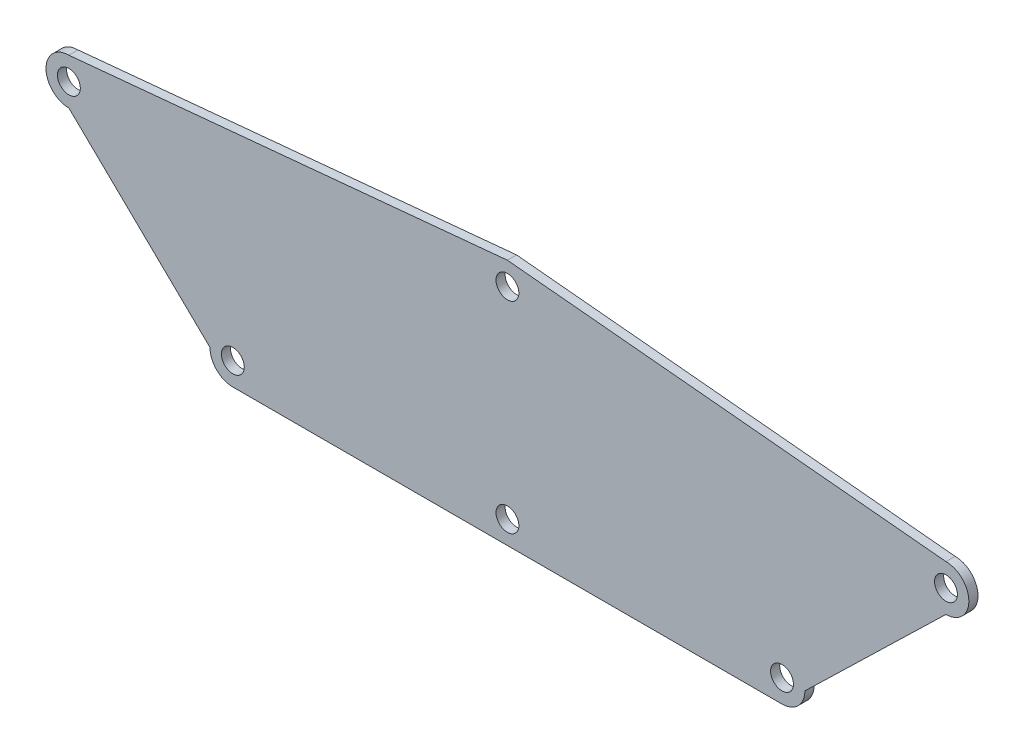
ISO-10303-21;
HEADER;
FILE_DESCRIPTION(('STEP AP214'),'2;1');
FILE_NAME('part.step','',(''),(''),'','','');
FILE_SCHEMA(('AUTOMOTIVE_DESIGN { 1 0 10303 214 1 1 1 1 }'));
ENDSEC;
DATA;
#1=APPLICATION_CONTEXT('core data for automotive mechanical design processes');
#2=APPLICATION_PROTOCOL_DEFINITION('international standard','automotive_design',2000,#1);
#3=PRODUCT_CONTEXT('',#1,'mechanical');
#4=PRODUCT('Part','Part','',(#3));
#5=PRODUCT_RELATED_PRODUCT_CATEGORY('part','',(#4));
#6=PRODUCT_DEFINITION_FORMATION('','',#4);
#7=PRODUCT_DEFINITION_CONTEXT('part definition',#1,'design');
#8=PRODUCT_DEFINITION('design','',#6,#7);
#9=PRODUCT_DEFINITION_SHAPE('','',#8);
#10=(LENGTH_UNIT() NAMED_UNIT(*) SI_UNIT(.MILLI.,.METRE.));
#11=(NAMED_UNIT(*) PLANE_ANGLE_UNIT() SI_UNIT($,.RADIAN.));
#12=(NAMED_UNIT(*) SI_UNIT($,.STERADIAN.) SOLID_ANGLE_UNIT());
#13=UNCERTAINTY_MEASURE_WITH_UNIT(LENGTH_MEASURE(1.E-05),#10,'distance_accuracy_value','');
#14=(GEOMETRIC_REPRESENTATION_CONTEXT(3) GLOBAL_UNCERTAINTY_ASSIGNED_CONTEXT((#13)) GLOBAL_UNIT_ASSIGNED_CONTEXT((#10,
#11,#12)) REPRESENTATION_CONTEXT('',''));
#15=CARTESIAN_POINT('',(0.,0.,0.));
#16=DIRECTION('',(0.,0.,1.));
#17=DIRECTION('',(1.,0.,0.));
#18=AXIS2_PLACEMENT_3D('',#15,#16,#17);
#19=CARTESIAN_POINT('',(31.4847093761798,-32.4841374358191,2.));
#20=DIRECTION('',(0.695974241081465,-0.718066748813144,0.));
#21=DIRECTION('',(0.718066748813144,0.695974241081465,0.));
#22=AXIS2_PLACEMENT_3D('',#19,#20,#21);
#23=PLANE('',#22);
#24=DIRECTION('',(-0.718066748813144,-0.695974241081465,0.));
#25=VECTOR('',#24,1.);
#26=CARTESIAN_POINT('',(31.4847093761798,-32.4841374358191,0.));
#27=LINE('',#26,#25);
#28=CARTESIAN_POINT('',(95.8263707407327,29.8779466073845,0.));
#29=VERTEX_POINT('',#28);
#30=CARTESIAN_POINT('',(65.,0.,0.));
#31=VERTEX_POINT('',#30);
#32=EDGE_CURVE('E153',#29,#31,#27,.T.);
#33=ORIENTED_EDGE('',*,*,#32,.F.);
#34=DIRECTION('',(0.,0.,-1.));
#35=VECTOR('',#34,1.);
#36=CARTESIAN_POINT('',(95.8263707407327,29.8779466073845,2.));
#37=LINE('',#36,#35);
#38=CARTESIAN_POINT('',(95.8263707407327,29.8779466073845,2.));
#39=VERTEX_POINT('',#38);
#40=EDGE_CURVE('E11',#39,#29,#37,.T.);
#41=ORIENTED_EDGE('',*,*,#40,.F.);
#42=DIRECTION('',(-0.718066748813144,-0.695974241081465,0.));
#43=VECTOR('',#42,1.);
#44=CARTESIAN_POINT('',(31.4847093761798,-32.4841374358191,2.));
#45=LINE('',#44,#43);
#46=CARTESIAN_POINT('',(65.,0.,2.));
#47=VERTEX_POINT('',#46);
#48=EDGE_CURVE('E192',#39,#47,#45,.T.);
#49=ORIENTED_EDGE('',*,*,#48,.T.);
#50=DIRECTION('',(0.,0.,-1.));
#51=VECTOR('',#50,1.);
#52=CARTESIAN_POINT('',(65.,0.,2.));
#53=LINE('',#52,#51);
#54=EDGE_CURVE('E87',#47,#31,#53,.T.);
#55=ORIENTED_EDGE('',*,*,#54,.T.);
#56=EDGE_LOOP('',(#33,#41,#49,#55));
#57=FACE_BOUND('',#56,.T.);
#58=ADVANCED_FACE('F34',(#57),#23,.T.);
#59=CARTESIAN_POINT('',(95.8263707407328,34.8779466073845,2.));
#60=DIRECTION('',(0.,0.,-1.));
#61=DIRECTION('',(-1.,0.,0.));
#62=AXIS2_PLACEMENT_3D('',#59,#60,#61);
#63=CYLINDRICAL_SURFACE('',#62,5.00000000000001);
#64=CARTESIAN_POINT('',(95.8263707407328,34.8779466073845,0.));
#65=DIRECTION('',(0.,0.,1.));
#66=DIRECTION('',(1.,0.,0.));
#67=AXIS2_PLACEMENT_3D('',#64,#65,#66);
#68=CIRCLE('',#67,5.00000000000001);
#69=CARTESIAN_POINT('',(95.8263707407328,39.8779466073845,0.));
#70=VERTEX_POINT('',#69);
#71=EDGE_CURVE('E156',#29,#70,#68,.T.);
#72=ORIENTED_EDGE('',*,*,#71,.T.);
#73=DIRECTION('',(0.,0.,-1.));
#74=VECTOR('',#73,1.);
#75=CARTESIAN_POINT('',(95.8263707407328,39.8779466073845,2.));
#76=LINE('',#75,#74);
#77=CARTESIAN_POINT('',(95.8263707407328,39.8779466073845,2.));
#78=VERTEX_POINT('',#77);
#79=EDGE_CURVE('E42',#78,#70,#76,.T.);
#80=ORIENTED_EDGE('',*,*,#79,.F.);
#81=CARTESIAN_POINT('',(95.8263707407328,34.8779466073845,2.));
#82=DIRECTION('',(0.,0.,1.));
#83=DIRECTION('',(1.,0.,0.));
#84=AXIS2_PLACEMENT_3D('',#81,#82,#83);
#85=CIRCLE('',#84,5.00000000000001);
#86=EDGE_CURVE('E224',#39,#78,#85,.T.);
#87=ORIENTED_EDGE('',*,*,#86,.F.);
#88=ORIENTED_EDGE('',*,*,#40,.T.);
#89=EDGE_LOOP('',(#72,#80,#87,#88));
#90=FACE_BOUND('',#89,.T.);
#91=ADVANCED_FACE('F211',(#90),#63,.T.);
#92=CARTESIAN_POINT('',(4.62259535135623,48.5599586911038,2.));
#93=DIRECTION('',(0.0947651564417708,0.995499656014288,0.));
#94=DIRECTION('',(-0.995499656014289,0.0947651564417708,0.));
#95=AXIS2_PLACEMENT_3D('',#92,#93,#94);
#96=PLANE('',#95);
#97=DIRECTION('',(0.995499656014289,-0.0947651564417708,0.));
#98=VECTOR('',#97,1.);
#99=CARTESIAN_POINT('',(4.62259535135623,48.5599586911038,0.));
#100=LINE('',#99,#98);
#101=CARTESIAN_POINT('',(0.,49.,0.));
#102=VERTEX_POINT('',#101);
#103=EDGE_CURVE('E159',#102,#70,#100,.T.);
#104=ORIENTED_EDGE('',*,*,#103,.F.);
#105=DIRECTION('',(0.,0.,-1.));
#106=VECTOR('',#105,1.);
#107=CARTESIAN_POINT('',(0.,49.,2.));
#108=LINE('',#107,#106);
#109=CARTESIAN_POINT('',(0.,49.,2.));
#110=VERTEX_POINT('',#109);
#111=EDGE_CURVE('E201',#110,#102,#108,.T.);
#112=ORIENTED_EDGE('',*,*,#111,.F.);
#113=DIRECTION('',(0.995499656014289,-0.0947651564417708,0.));
#114=VECTOR('',#113,1.);
#115=CARTESIAN_POINT('',(4.62259535135623,48.5599586911038,2.));
#116=LINE('',#115,#114);
#117=EDGE_CURVE('E208',#110,#78,#116,.T.);
#118=ORIENTED_EDGE('',*,*,#117,.T.);
#119=ORIENTED_EDGE('',*,*,#79,.T.);
#120=EDGE_LOOP('',(#104,#112,#118,#119));
#121=FACE_BOUND('',#120,.T.);
#122=ADVANCED_FACE('F206',(#121),#96,.T.);
#123=CARTESIAN_POINT('',(-4.62259535135623,48.5599586911038,2.));
#124=DIRECTION('',(-0.0947651564417708,0.995499656014288,0.));
#125=DIRECTION('',(-0.995499656014289,-0.0947651564417708,0.));
#126=AXIS2_PLACEMENT_3D('',#123,#124,#125);
#127=PLANE('',#126);
#128=DIRECTION('',(0.995499656014289,0.0947651564417708,0.));
#129=VECTOR('',#128,1.);
#130=CARTESIAN_POINT('',(-4.62259535135623,48.5599586911038,0.));
#131=LINE('',#130,#129);
#132=CARTESIAN_POINT('',(-95.8263707407328,39.8779466073845,0.));
#133=VERTEX_POINT('',#132);
#134=EDGE_CURVE('E162',#133,#102,#131,.T.);
#135=ORIENTED_EDGE('',*,*,#134,.F.);
#136=DIRECTION('',(0.,0.,-1.));
#137=VECTOR('',#136,1.);
#138=CARTESIAN_POINT('',(-95.8263707407328,39.8779466073845,2.));
#139=LINE('',#138,#137);
#140=CARTESIAN_POINT('',(-95.8263707407328,39.8779466073845,2.));
#141=VERTEX_POINT('',#140);
#142=EDGE_CURVE('E199',#141,#133,#139,.T.);
#143=ORIENTED_EDGE('',*,*,#142,.F.);
#144=DIRECTION('',(0.995499656014289,0.0947651564417708,0.));
#145=VECTOR('',#144,1.);
#146=CARTESIAN_POINT('',(-4.62259535135623,48.5599586911038,2.));
#147=LINE('',#146,#145);
#148=EDGE_CURVE('E223',#141,#110,#147,.T.);
#149=ORIENTED_EDGE('',*,*,#148,.T.);
#150=ORIENTED_EDGE('',*,*,#111,.T.);
#151=EDGE_LOOP('',(#135,#143,#149,#150));
#152=FACE_BOUND('',#151,.T.);
#153=ADVANCED_FACE('F219',(#152),#127,.T.);
#154=CARTESIAN_POINT('',(-95.8263707407327,34.8779466073845,2.));
#155=DIRECTION('',(0.,0.,-1.));
#156=DIRECTION('',(-1.,0.,0.));
#157=AXIS2_PLACEMENT_3D('',#154,#155,#156);
#158=CYLINDRICAL_SURFACE('',#157,5.00000000000001);
#159=CARTESIAN_POINT('',(-95.8263707407327,34.8779466073845,0.));
#160=DIRECTION('',(0.,0.,1.));
#161=DIRECTION('',(1.,0.,0.));
#162=AXIS2_PLACEMENT_3D('',#159,#160,#161);
#163=CIRCLE('',#162,5.00000000000001);
#164=CARTESIAN_POINT('',(-95.8263707407327,29.8779466073845,0.));
#165=VERTEX_POINT('',#164);
#166=EDGE_CURVE('E165',#133,#165,#163,.T.);
#167=ORIENTED_EDGE('',*,*,#166,.T.);
#168=DIRECTION('',(0.,0.,-1.));
#169=VECTOR('',#168,1.);
#170=CARTESIAN_POINT('',(-95.8263707407327,29.8779466073845,2.));
#171=LINE('',#170,#169);
#172=CARTESIAN_POINT('',(-95.8263707407327,29.8779466073845,2.));
#173=VERTEX_POINT('',#172);
#174=EDGE_CURVE('E196',#173,#165,#171,.T.);
#175=ORIENTED_EDGE('',*,*,#174,.F.);
#176=CARTESIAN_POINT('',(-95.8263707407327,34.8779466073845,2.));
#177=DIRECTION('',(0.,0.,1.));
#178=DIRECTION('',(1.,0.,0.));
#179=AXIS2_PLACEMENT_3D('',#176,#177,#178);
#180=CIRCLE('',#179,5.00000000000001);
#181=EDGE_CURVE('E226',#141,#173,#180,.T.);
#182=ORIENTED_EDGE('',*,*,#181,.F.);
#183=ORIENTED_EDGE('',*,*,#142,.T.);
#184=EDGE_LOOP('',(#167,#175,#182,#183));
#185=FACE_BOUND('',#184,.T.);
#186=ADVANCED_FACE('F233',(#185),#158,.T.);
#187=CARTESIAN_POINT('',(-31.4847093761798,-32.4841374358191,2.));
#188=DIRECTION('',(0.695974241081465,0.718066748813144,0.));
#189=DIRECTION('',(-0.718066748813144,0.695974241081465,0.));
#190=AXIS2_PLACEMENT_3D('',#187,#188,#189);
#191=PLANE('',#190);
#192=DIRECTION('',(0.718066748813144,-0.695974241081465,0.));
#193=VECTOR('',#192,1.);
#194=CARTESIAN_POINT('',(-31.4847093761798,-32.4841374358191,0.));
#195=LINE('',#194,#193);
#196=CARTESIAN_POINT('',(-65.,0.,0.));
#197=VERTEX_POINT('',#196);
#198=EDGE_CURVE('E167',#165,#197,#195,.T.);
#199=ORIENTED_EDGE('',*,*,#198,.T.);
#200=DIRECTION('',(0.,0.,-1.));
#201=VECTOR('',#200,1.);
#202=CARTESIAN_POINT('',(-65.,0.,2.));
#203=LINE('',#202,#201);
#204=CARTESIAN_POINT('',(-65.,0.,2.));
#205=VERTEX_POINT('',#204);
#206=EDGE_CURVE('E128',#205,#197,#203,.T.);
#207=ORIENTED_EDGE('',*,*,#206,.F.);
#208=DIRECTION('',(0.718066748813144,-0.695974241081465,0.));
#209=VECTOR('',#208,1.);
#210=CARTESIAN_POINT('',(-31.4847093761798,-32.4841374358191,2.));
#211=LINE('',#210,#209);
#212=EDGE_CURVE('E115',#173,#205,#211,.T.);
#213=ORIENTED_EDGE('',*,*,#212,.F.);
#214=ORIENTED_EDGE('',*,*,#174,.T.);
#215=EDGE_LOOP('',(#199,#207,#213,#214));
#216=FACE_BOUND('',#215,.T.);
#217=ADVANCED_FACE('F235',(#216),#191,.F.);
#218=CARTESIAN_POINT('',(-60.,0.,2.));
#219=DIRECTION('',(0.,0.,-1.));
#220=DIRECTION('',(-1.,0.,0.));
#221=AXIS2_PLACEMENT_3D('',#218,#219,#220);
#222=CYLINDRICAL_SURFACE('',#221,5.);
#223=CARTESIAN_POINT('',(-60.,0.,0.));
#224=DIRECTION('',(0.,0.,1.));
#225=DIRECTION('',(1.,0.,0.));
#226=AXIS2_PLACEMENT_3D('',#223,#224,#225);
#227=CIRCLE('',#226,5.);
#228=CARTESIAN_POINT('',(-60.,-5.,0.));
#229=VERTEX_POINT('',#228);
#230=EDGE_CURVE('E124',#197,#229,#227,.T.);
#231=ORIENTED_EDGE('',*,*,#230,.T.);
#232=DIRECTION('',(0.,0.,-1.));
#233=VECTOR('',#232,1.);
#234=CARTESIAN_POINT('',(-60.,-5.,2.));
#235=LINE('',#234,#233);
#236=CARTESIAN_POINT('',(-60.,-5.,2.));
#237=VERTEX_POINT('',#236);
#238=EDGE_CURVE('E121',#237,#229,#235,.T.);
#239=ORIENTED_EDGE('',*,*,#238,.F.);
#240=CARTESIAN_POINT('',(-60.,0.,2.));
#241=DIRECTION('',(0.,0.,1.));
#242=DIRECTION('',(1.,0.,0.));
#243=AXIS2_PLACEMENT_3D('',#240,#241,#242);
#244=CIRCLE('',#243,5.);
#245=EDGE_CURVE('E108',#205,#237,#244,.T.);
#246=ORIENTED_EDGE('',*,*,#245,.F.);
#247=ORIENTED_EDGE('',*,*,#206,.T.);
#248=EDGE_LOOP('',(#231,#239,#246,#247));
#249=FACE_BOUND('',#248,.T.);
#250=ADVANCED_FACE('F122',(#249),#222,.T.);
#251=CARTESIAN_POINT('',(0.,-5.,2.));
#252=DIRECTION('',(0.,-1.,0.));
#253=DIRECTION('',(1.,0.,0.));
#254=AXIS2_PLACEMENT_3D('',#251,#252,#253);
#255=PLANE('',#254);
#256=DIRECTION('',(-1.,0.,0.));
#257=VECTOR('',#256,1.);
#258=CARTESIAN_POINT('',(0.,-5.,0.));
#259=LINE('',#258,#257);
#260=CARTESIAN_POINT('',(60.,-5.,0.));
#261=VERTEX_POINT('',#260);
#262=EDGE_CURVE('E170',#261,#229,#259,.T.);
#263=ORIENTED_EDGE('',*,*,#262,.F.);
#264=DIRECTION('',(0.,0.,-1.));
#265=VECTOR('',#264,1.);
#266=CARTESIAN_POINT('',(60.,-5.,2.));
#267=LINE('',#266,#265);
#268=CARTESIAN_POINT('',(60.,-5.,2.));
#269=VERTEX_POINT('',#268);
#270=EDGE_CURVE('E80',#269,#261,#267,.T.);
#271=ORIENTED_EDGE('',*,*,#270,.F.);
#272=DIRECTION('',(-1.,0.,0.));
#273=VECTOR('',#272,1.);
#274=CARTESIAN_POINT('',(0.,-5.,2.));
#275=LINE('',#274,#273);
#276=EDGE_CURVE('E113',#269,#237,#275,.T.);
#277=ORIENTED_EDGE('',*,*,#276,.T.);
#278=ORIENTED_EDGE('',*,*,#238,.T.);
#279=EDGE_LOOP('',(#263,#271,#277,#278));
#280=FACE_BOUND('',#279,.T.);
#281=ADVANCED_FACE('F130',(#280),#255,.T.);
#282=CARTESIAN_POINT('',(0.,44.,2.));
#283=DIRECTION('',(0.,0.,-1.));
#284=DIRECTION('',(-1.,0.,0.));
#285=AXIS2_PLACEMENT_3D('',#282,#283,#284);
#286=CYLINDRICAL_SURFACE('',#285,2.5);
#287=CARTESIAN_POINT('',(0.,44.,2.));
#288=DIRECTION('',(0.,0.,1.));
#289=DIRECTION('',(1.,0.,0.));
#290=AXIS2_PLACEMENT_3D('',#287,#288,#289);
#291=CIRCLE('',#290,2.5);
#292=CARTESIAN_POINT('',(2.5,44.,2.));
#293=VERTEX_POINT('',#292);
#294=EDGE_CURVE('E147',#293,#293,#291,.T.);
#295=ORIENTED_EDGE('',*,*,#294,.T.);
#296=EDGE_LOOP('',(#295));
#297=FACE_BOUND('',#296,.T.);
#298=CARTESIAN_POINT('',(0.,44.,0.));
#299=DIRECTION('',(0.,0.,1.));
#300=DIRECTION('',(1.,0.,0.));
#301=AXIS2_PLACEMENT_3D('',#298,#299,#300);
#302=CIRCLE('',#301,2.5);
#303=CARTESIAN_POINT('',(2.5,44.,0.));
#304=VERTEX_POINT('',#303);
#305=EDGE_CURVE('E186',#304,#304,#302,.T.);
#306=ORIENTED_EDGE('',*,*,#305,.F.);
#307=EDGE_LOOP('',(#306));
#308=FACE_BOUND('',#307,.T.);
#309=ADVANCED_FACE('F256',(#297,#308),#286,.F.);
#310=CARTESIAN_POINT('',(-95.8263707407327,34.8779466073845,2.));
#311=DIRECTION('',(0.,0.,-1.));
#312=DIRECTION('',(-1.,0.,0.));
#313=AXIS2_PLACEMENT_3D('',#310,#311,#312);
#314=CYLINDRICAL_SURFACE('',#313,2.5);
#315=CARTESIAN_POINT('',(-95.8263707407327,34.8779466073845,2.));
#316=DIRECTION('',(0.,0.,1.));
#317=DIRECTION('',(1.,0.,0.));
#318=AXIS2_PLACEMENT_3D('',#315,#316,#317);
#319=CIRCLE('',#318,2.5);
#320=CARTESIAN_POINT('',(-93.3263707407327,34.8779466073845,2.));
#321=VERTEX_POINT('',#320);
#322=EDGE_CURVE('E144',#321,#321,#319,.T.);
#323=ORIENTED_EDGE('',*,*,#322,.T.);
#324=EDGE_LOOP('',(#323));
#325=FACE_BOUND('',#324,.T.);
#326=CARTESIAN_POINT('',(-95.8263707407327,34.8779466073845,0.));
#327=DIRECTION('',(0.,0.,1.));
#328=DIRECTION('',(1.,0.,0.));
#329=AXIS2_PLACEMENT_3D('',#326,#327,#328);
#330=CIRCLE('',#329,2.5);
#331=CARTESIAN_POINT('',(-93.3263707407327,34.8779466073845,0.));
#332=VERTEX_POINT('',#331);
#333=EDGE_CURVE('E183',#332,#332,#330,.T.);
#334=ORIENTED_EDGE('',*,*,#333,.F.);
#335=EDGE_LOOP('',(#334));
#336=FACE_BOUND('',#335,.T.);
#337=ADVANCED_FACE('F271',(#325,#336),#314,.F.);
#338=CARTESIAN_POINT('',(-60.,0.,2.));
#339=DIRECTION('',(0.,0.,-1.));
#340=DIRECTION('',(-1.,0.,0.));
#341=AXIS2_PLACEMENT_3D('',#338,#339,#340);
#342=CYLINDRICAL_SURFACE('',#341,2.5);
#343=CARTESIAN_POINT('',(-60.,0.,2.));
#344=DIRECTION('',(0.,0.,1.));
#345=DIRECTION('',(1.,0.,0.));
#346=AXIS2_PLACEMENT_3D('',#343,#344,#345);
#347=CIRCLE('',#346,2.5);
#348=CARTESIAN_POINT('',(-57.5,0.,2.));
#349=VERTEX_POINT('',#348);
#350=EDGE_CURVE('E141',#349,#349,#347,.T.);
#351=ORIENTED_EDGE('',*,*,#350,.T.);
#352=EDGE_LOOP('',(#351));
#353=FACE_BOUND('',#352,.T.);
#354=CARTESIAN_POINT('',(-60.,0.,0.));
#355=DIRECTION('',(0.,0.,1.));
#356=DIRECTION('',(1.,0.,0.));
#357=AXIS2_PLACEMENT_3D('',#354,#355,#356);
#358=CIRCLE('',#357,2.5);
#359=CARTESIAN_POINT('',(-57.5,0.,0.));
#360=VERTEX_POINT('',#359);
#361=EDGE_CURVE('E180',#360,#360,#358,.T.);
#362=ORIENTED_EDGE('',*,*,#361,.F.);
#363=EDGE_LOOP('',(#362));
#364=FACE_BOUND('',#363,.T.);
#365=ADVANCED_FACE('F267',(#353,#364),#342,.F.);
#366=CARTESIAN_POINT('',(0.,0.,2.));
#367=DIRECTION('',(0.,0.,-1.));
#368=DIRECTION('',(-1.,0.,0.));
#369=AXIS2_PLACEMENT_3D('',#366,#367,#368);
#370=CYLINDRICAL_SURFACE('',#369,2.5);
#371=CARTESIAN_POINT('',(0.,0.,2.));
#372=DIRECTION('',(0.,0.,1.));
#373=DIRECTION('',(1.,0.,0.));
#374=AXIS2_PLACEMENT_3D('',#371,#372,#373);
#375=CIRCLE('',#374,2.5);
#376=CARTESIAN_POINT('',(2.5,0.,2.));
#377=VERTEX_POINT('',#376);
#378=EDGE_CURVE('E138',#377,#377,#375,.T.);
#379=ORIENTED_EDGE('',*,*,#378,.T.);
#380=EDGE_LOOP('',(#379));
#381=FACE_BOUND('',#380,.T.);
#382=CARTESIAN_POINT('',(0.,0.,0.));
#383=DIRECTION('',(0.,0.,1.));
#384=DIRECTION('',(1.,0.,0.));
#385=AXIS2_PLACEMENT_3D('',#382,#383,#384);
#386=CIRCLE('',#385,2.5);
#387=CARTESIAN_POINT('',(2.5,0.,0.));
#388=VERTEX_POINT('',#387);
#389=EDGE_CURVE('E177',#388,#388,#386,.T.);
#390=ORIENTED_EDGE('',*,*,#389,.F.);
#391=EDGE_LOOP('',(#390));
#392=FACE_BOUND('',#391,.T.);
#393=ADVANCED_FACE('F263',(#381,#392),#370,.F.);
#394=CARTESIAN_POINT('',(60.,0.,2.));
#395=DIRECTION('',(0.,0.,-1.));
#396=DIRECTION('',(-1.,0.,0.));
#397=AXIS2_PLACEMENT_3D('',#394,#395,#396);
#398=CYLINDRICAL_SURFACE('',#397,2.5);
#399=CARTESIAN_POINT('',(60.,0.,2.));
#400=DIRECTION('',(0.,0.,1.));
#401=DIRECTION('',(1.,0.,0.));
#402=AXIS2_PLACEMENT_3D('',#399,#400,#401);
#403=CIRCLE('',#402,2.5);
#404=CARTESIAN_POINT('',(62.5,0.,2.));
#405=VERTEX_POINT('',#404);
#406=EDGE_CURVE('E132',#405,#405,#403,.T.);
#407=ORIENTED_EDGE('',*,*,#406,.T.);
#408=EDGE_LOOP('',(#407));
#409=FACE_BOUND('',#408,.T.);
#410=CARTESIAN_POINT('',(60.,0.,0.));
#411=DIRECTION('',(0.,0.,1.));
#412=DIRECTION('',(1.,0.,0.));
#413=AXIS2_PLACEMENT_3D('',#410,#411,#412);
#414=CIRCLE('',#413,2.5);
#415=CARTESIAN_POINT('',(62.5,0.,0.));
#416=VERTEX_POINT('',#415);
#417=EDGE_CURVE('E174',#416,#416,#414,.T.);
#418=ORIENTED_EDGE('',*,*,#417,.F.);
#419=EDGE_LOOP('',(#418));
#420=FACE_BOUND('',#419,.T.);
#421=ADVANCED_FACE('F260',(#409,#420),#398,.F.);
#422=CARTESIAN_POINT('',(60.,0.,2.));
#423=DIRECTION('',(0.,0.,-1.));
#424=DIRECTION('',(-1.,0.,0.));
#425=AXIS2_PLACEMENT_3D('',#422,#423,#424);
#426=CYLINDRICAL_SURFACE('',#425,5.);
#427=CARTESIAN_POINT('',(60.,0.,0.));
#428=DIRECTION('',(0.,0.,1.));
#429=DIRECTION('',(1.,0.,0.));
#430=AXIS2_PLACEMENT_3D('',#427,#428,#429);
#431=CIRCLE('',#430,5.);
#432=EDGE_CURVE('E172',#261,#31,#431,.T.);
#433=ORIENTED_EDGE('',*,*,#432,.T.);
#434=ORIENTED_EDGE('',*,*,#54,.F.);
#435=CARTESIAN_POINT('',(60.,0.,2.));
#436=DIRECTION('',(0.,0.,1.));
#437=DIRECTION('',(1.,0.,0.));
#438=AXIS2_PLACEMENT_3D('',#435,#436,#437);
#439=CIRCLE('',#438,5.);
#440=EDGE_CURVE('E50',#269,#47,#439,.T.);
#441=ORIENTED_EDGE('',*,*,#440,.F.);
#442=ORIENTED_EDGE('',*,*,#270,.T.);
#443=EDGE_LOOP('',(#433,#434,#441,#442));
#444=FACE_BOUND('',#443,.T.);
#445=ADVANCED_FACE('F236',(#444),#426,.T.);
#446=CARTESIAN_POINT('',(95.8263707407328,34.8779466073845,2.));
#447=DIRECTION('',(0.,0.,-1.));
#448=DIRECTION('',(-1.,0.,0.));
#449=AXIS2_PLACEMENT_3D('',#446,#447,#448);
#450=CYLINDRICAL_SURFACE('',#449,2.50000000000001);
#451=CARTESIAN_POINT('',(95.8263707407328,34.8779466073845,2.));
#452=DIRECTION('',(0.,0.,1.));
#453=DIRECTION('',(1.,0.,0.));
#454=AXIS2_PLACEMENT_3D('',#451,#452,#453);
#455=CIRCLE('',#454,2.50000000000001);
#456=CARTESIAN_POINT('',(98.3263707407328,34.8779466073845,2.));
#457=VERTEX_POINT('',#456);
#458=EDGE_CURVE('E150',#457,#457,#455,.T.);
#459=ORIENTED_EDGE('',*,*,#458,.T.);
#460=EDGE_LOOP('',(#459));
#461=FACE_BOUND('',#460,.T.);
#462=CARTESIAN_POINT('',(95.8263707407328,34.8779466073845,0.));
#463=DIRECTION('',(0.,0.,1.));
#464=DIRECTION('',(1.,0.,0.));
#465=AXIS2_PLACEMENT_3D('',#462,#463,#464);
#466=CIRCLE('',#465,2.50000000000001);
#467=CARTESIAN_POINT('',(98.3263707407328,34.8779466073845,0.));
#468=VERTEX_POINT('',#467);
#469=EDGE_CURVE('E189',#468,#468,#466,.T.);
#470=ORIENTED_EDGE('',*,*,#469,.F.);
#471=EDGE_LOOP('',(#470));
#472=FACE_BOUND('',#471,.T.);
#473=ADVANCED_FACE('F259',(#461,#472),#450,.F.);
#474=CARTESIAN_POINT('',(0.,0.,2.));
#475=DIRECTION('',(0.,0.,1.));
#476=DIRECTION('',(1.,0.,0.));
#477=AXIS2_PLACEMENT_3D('',#474,#475,#476);
#478=PLANE('',#477);
#479=ORIENTED_EDGE('',*,*,#48,.F.);
#480=ORIENTED_EDGE('',*,*,#86,.T.);
#481=ORIENTED_EDGE('',*,*,#117,.F.);
#482=ORIENTED_EDGE('',*,*,#148,.F.);
#483=ORIENTED_EDGE('',*,*,#181,.T.);
#484=ORIENTED_EDGE('',*,*,#212,.T.);
#485=ORIENTED_EDGE('',*,*,#245,.T.);
#486=ORIENTED_EDGE('',*,*,#276,.F.);
#487=ORIENTED_EDGE('',*,*,#440,.T.);
#488=EDGE_LOOP('',(#479,#480,#481,#482,#483,#484,#485,#486,#487));
#489=FACE_BOUND('',#488,.T.);
#490=ORIENTED_EDGE('',*,*,#406,.F.);
#491=EDGE_LOOP('',(#490));
#492=FACE_BOUND('',#491,.T.);
#493=ORIENTED_EDGE('',*,*,#378,.F.);
#494=EDGE_LOOP('',(#493));
#495=FACE_BOUND('',#494,.T.);
#496=ORIENTED_EDGE('',*,*,#350,.F.);
#497=EDGE_LOOP('',(#496));
#498=FACE_BOUND('',#497,.T.);
#499=ORIENTED_EDGE('',*,*,#322,.F.);
#500=EDGE_LOOP('',(#499));
#501=FACE_BOUND('',#500,.T.);
#502=ORIENTED_EDGE('',*,*,#294,.F.);
#503=EDGE_LOOP('',(#502));
#504=FACE_BOUND('',#503,.T.);
#505=ORIENTED_EDGE('',*,*,#458,.F.);
#506=EDGE_LOOP('',(#505));
#507=FACE_BOUND('',#506,.T.);
#508=ADVANCED_FACE('F110',(#489,#492,#495,#498,#501,#504,#507),#478,.T.);
#509=CARTESIAN_POINT('',(0.,0.,0.));
#510=DIRECTION('',(0.,0.,1.));
#511=DIRECTION('',(1.,0.,0.));
#512=AXIS2_PLACEMENT_3D('',#509,#510,#511);
#513=PLANE('',#512);
#514=ORIENTED_EDGE('',*,*,#32,.T.);
#515=ORIENTED_EDGE('',*,*,#432,.F.);
#516=ORIENTED_EDGE('',*,*,#262,.T.);
#517=ORIENTED_EDGE('',*,*,#230,.F.);
#518=ORIENTED_EDGE('',*,*,#198,.F.);
#519=ORIENTED_EDGE('',*,*,#166,.F.);
#520=ORIENTED_EDGE('',*,*,#134,.T.);
#521=ORIENTED_EDGE('',*,*,#103,.T.);
#522=ORIENTED_EDGE('',*,*,#71,.F.);
#523=EDGE_LOOP('',(#514,#515,#516,#517,#518,#519,#520,#521,#522));
#524=FACE_BOUND('',#523,.T.);
#525=ORIENTED_EDGE('',*,*,#417,.T.);
#526=EDGE_LOOP('',(#525));
#527=FACE_BOUND('',#526,.T.);
#528=ORIENTED_EDGE('',*,*,#389,.T.);
#529=EDGE_LOOP('',(#528));
#530=FACE_BOUND('',#529,.T.);
#531=ORIENTED_EDGE('',*,*,#361,.T.);
#532=EDGE_LOOP('',(#531));
#533=FACE_BOUND('',#532,.T.);
#534=ORIENTED_EDGE('',*,*,#333,.T.);
#535=EDGE_LOOP('',(#534));
#536=FACE_BOUND('',#535,.T.);
#537=ORIENTED_EDGE('',*,*,#305,.T.);
#538=EDGE_LOOP('',(#537));
#539=FACE_BOUND('',#538,.T.);
#540=ORIENTED_EDGE('',*,*,#469,.T.);
#541=EDGE_LOOP('',(#540));
#542=FACE_BOUND('',#541,.T.);
#543=ADVANCED_FACE('F213',(#524,#527,#530,#533,#536,#539,#542),#513,.F.);
#544=CLOSED_SHELL('',(#58,#91,#122,#153,#186,#217,#250,#281,#309,#337,#365,#393,#421,#445,#473,
#508,#543));
#545=MANIFOLD_SOLID_BREP('B2',#544);
#546=ADVANCED_BREP_SHAPE_REPRESENTATION('',(#18,#545),#14);
#547=SHAPE_DEFINITION_REPRESENTATION(#9,#546);
ENDSEC;
END-ISO-10303-21;
